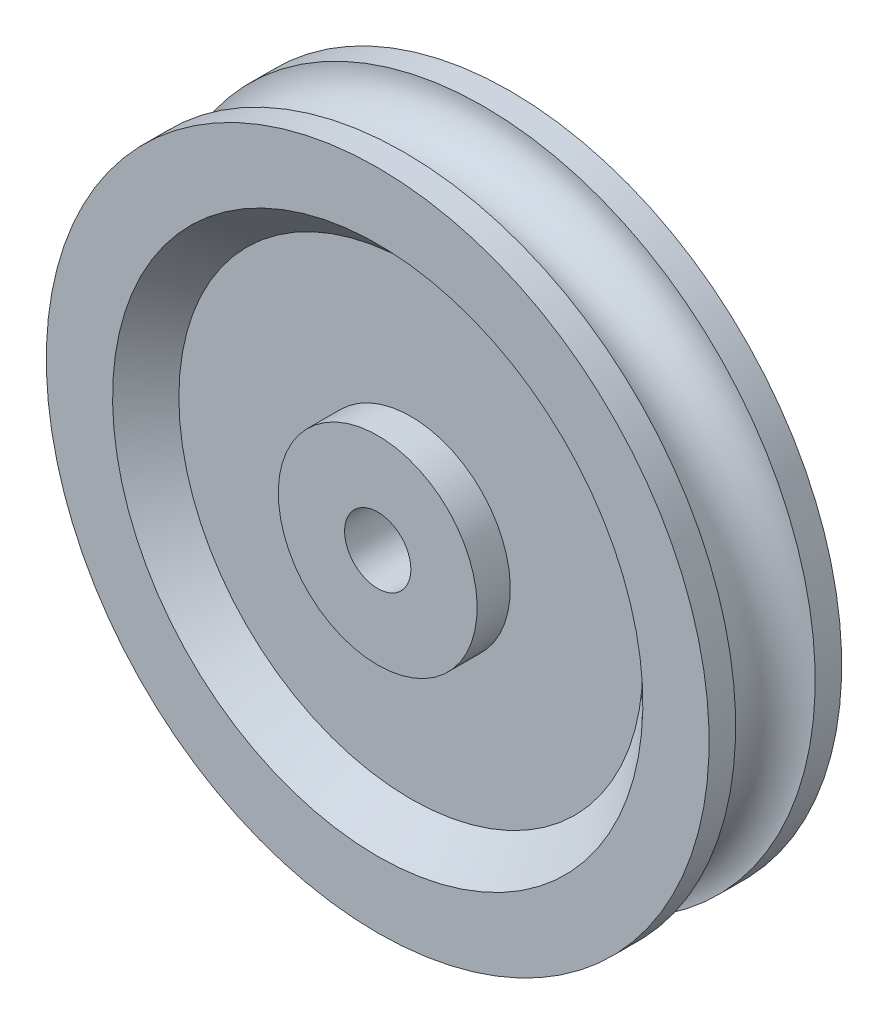
ISO-10303-21;
HEADER;
FILE_DESCRIPTION(('STEP AP214'),'2;1');
FILE_NAME('part.step','',(''),(''),'','','');
FILE_SCHEMA(('AUTOMOTIVE_DESIGN { 1 0 10303 214 1 1 1 1 }'));
ENDSEC;
DATA;
#1=APPLICATION_CONTEXT('core data for automotive mechanical design processes');
#2=APPLICATION_PROTOCOL_DEFINITION('international standard','automotive_design',2000,#1);
#3=PRODUCT_CONTEXT('',#1,'mechanical');
#4=PRODUCT('Part','Part','',(#3));
#5=PRODUCT_RELATED_PRODUCT_CATEGORY('part','',(#4));
#6=PRODUCT_DEFINITION_FORMATION('','',#4);
#7=PRODUCT_DEFINITION_CONTEXT('part definition',#1,'design');
#8=PRODUCT_DEFINITION('design','',#6,#7);
#9=PRODUCT_DEFINITION_SHAPE('','',#8);
#10=(LENGTH_UNIT() NAMED_UNIT(*) SI_UNIT(.MILLI.,.METRE.));
#11=(NAMED_UNIT(*) PLANE_ANGLE_UNIT() SI_UNIT($,.RADIAN.));
#12=(NAMED_UNIT(*) SI_UNIT($,.STERADIAN.) SOLID_ANGLE_UNIT());
#13=UNCERTAINTY_MEASURE_WITH_UNIT(LENGTH_MEASURE(1.E-05),#10,'distance_accuracy_value','');
#14=(GEOMETRIC_REPRESENTATION_CONTEXT(3) GLOBAL_UNCERTAINTY_ASSIGNED_CONTEXT((#13)) GLOBAL_UNIT_ASSIGNED_CONTEXT((#10,
#11,#12)) REPRESENTATION_CONTEXT('',''));
#15=CARTESIAN_POINT('',(0.,0.,0.));
#16=DIRECTION('',(0.,0.,1.));
#17=DIRECTION('',(1.,0.,0.));
#18=AXIS2_PLACEMENT_3D('',#15,#16,#17);
#19=CARTESIAN_POINT('',(0.,40.,-10.));
#20=DIRECTION('',(0.,0.,1.));
#21=DIRECTION('',(0.,-1.,0.));
#22=AXIS2_PLACEMENT_3D('',#19,#20,#21);
#23=PLANE('',#22);
#24=CARTESIAN_POINT('',(0.,0.,-10.));
#25=DIRECTION('',(0.,0.,1.));
#26=DIRECTION('',(0.,-1.,0.));
#27=AXIS2_PLACEMENT_3D('',#24,#25,#26);
#28=CIRCLE('',#27,50.);
#29=CARTESIAN_POINT('',(0.,-50.,-10.));
#30=VERTEX_POINT('',#29);
#31=EDGE_CURVE('E10',#30,#30,#28,.T.);
#32=ORIENTED_EDGE('',*,*,#31,.F.);
#33=EDGE_LOOP('',(#32));
#34=FACE_BOUND('',#33,.T.);
#35=CARTESIAN_POINT('',(0.,0.,-10.));
#36=DIRECTION('',(0.,0.,1.));
#37=DIRECTION('',(0.,-1.,0.));
#38=AXIS2_PLACEMENT_3D('',#35,#36,#37);
#39=CIRCLE('',#38,40.);
#40=CARTESIAN_POINT('',(0.,-40.,-10.));
#41=VERTEX_POINT('',#40);
#42=EDGE_CURVE('E73',#41,#41,#39,.T.);
#43=ORIENTED_EDGE('',*,*,#42,.T.);
#44=EDGE_LOOP('',(#43));
#45=FACE_BOUND('',#44,.T.);
#46=ADVANCED_FACE('F33',(#34,#45),#23,.F.);
#47=CARTESIAN_POINT('',(0.,0.,9.99999999999999));
#48=DIRECTION('',(0.,0.,1.));
#49=DIRECTION('',(0.,-1.,0.));
#50=AXIS2_PLACEMENT_3D('',#47,#48,#49);
#51=CYLINDRICAL_SURFACE('',#50,50.);
#52=CARTESIAN_POINT('',(0.,0.,-6.00000000000001));
#53=DIRECTION('',(0.,0.,1.));
#54=DIRECTION('',(0.,-1.,0.));
#55=AXIS2_PLACEMENT_3D('',#52,#53,#54);
#56=CIRCLE('',#55,50.);
#57=CARTESIAN_POINT('',(0.,-50.,-6.00000000000001));
#58=VERTEX_POINT('',#57);
#59=EDGE_CURVE('E39',#58,#58,#56,.T.);
#60=ORIENTED_EDGE('',*,*,#59,.F.);
#61=EDGE_LOOP('',(#60));
#62=FACE_BOUND('',#61,.T.);
#63=ORIENTED_EDGE('',*,*,#31,.T.);
#64=EDGE_LOOP('',(#63));
#65=FACE_BOUND('',#64,.T.);
#66=ADVANCED_FACE('F131',(#62,#65),#51,.T.);
#67=CARTESIAN_POINT('',(0.,0.,0.));
#68=DIRECTION('',(0.,0.,1.));
#69=DIRECTION('',(0.,-1.,0.));
#70=AXIS2_PLACEMENT_3D('',#67,#68,#69);
#71=TOROIDAL_SURFACE('',#70,50.,6.);
#72=CARTESIAN_POINT('',(0.,0.,5.99999999999999));
#73=DIRECTION('',(0.,0.,1.));
#74=DIRECTION('',(0.,-1.,0.));
#75=AXIS2_PLACEMENT_3D('',#72,#73,#74);
#76=CIRCLE('',#75,50.);
#77=CARTESIAN_POINT('',(0.,-50.,5.99999999999999));
#78=VERTEX_POINT('',#77);
#79=EDGE_CURVE('E43',#78,#78,#76,.T.);
#80=ORIENTED_EDGE('',*,*,#79,.F.);
#81=EDGE_LOOP('',(#80));
#82=FACE_BOUND('',#81,.T.);
#83=ORIENTED_EDGE('',*,*,#59,.T.);
#84=EDGE_LOOP('',(#83));
#85=FACE_BOUND('',#84,.T.);
#86=ADVANCED_FACE('F126',(#82,#85),#71,.F.);
#87=CARTESIAN_POINT('',(0.,0.,9.99999999999999));
#88=DIRECTION('',(0.,0.,1.));
#89=DIRECTION('',(0.,-1.,0.));
#90=AXIS2_PLACEMENT_3D('',#87,#88,#89);
#91=CYLINDRICAL_SURFACE('',#90,50.);
#92=CARTESIAN_POINT('',(0.,0.,10.));
#93=DIRECTION('',(0.,0.,1.));
#94=DIRECTION('',(0.,-1.,0.));
#95=AXIS2_PLACEMENT_3D('',#92,#93,#94);
#96=CIRCLE('',#95,50.);
#97=CARTESIAN_POINT('',(0.,-50.,9.99999999999999));
#98=VERTEX_POINT('',#97);
#99=EDGE_CURVE('E47',#98,#98,#96,.T.);
#100=ORIENTED_EDGE('',*,*,#99,.F.);
#101=EDGE_LOOP('',(#100));
#102=FACE_BOUND('',#101,.T.);
#103=ORIENTED_EDGE('',*,*,#79,.T.);
#104=EDGE_LOOP('',(#103));
#105=FACE_BOUND('',#104,.T.);
#106=ADVANCED_FACE('F120',(#102,#105),#91,.T.);
#107=CARTESIAN_POINT('',(0.,40.,10.));
#108=DIRECTION('',(0.,0.,-1.));
#109=DIRECTION('',(0.,1.,0.));
#110=AXIS2_PLACEMENT_3D('',#107,#108,#109);
#111=PLANE('',#110);
#112=CARTESIAN_POINT('',(0.,0.,9.99999999999999));
#113=DIRECTION('',(0.,0.,1.));
#114=DIRECTION('',(0.,-1.,0.));
#115=AXIS2_PLACEMENT_3D('',#112,#113,#114);
#116=CIRCLE('',#115,40.);
#117=CARTESIAN_POINT('',(0.,-40.,9.99999999999998));
#118=VERTEX_POINT('',#117);
#119=EDGE_CURVE('E52',#118,#118,#116,.T.);
#120=ORIENTED_EDGE('',*,*,#119,.F.);
#121=EDGE_LOOP('',(#120));
#122=FACE_BOUND('',#121,.T.);
#123=ORIENTED_EDGE('',*,*,#99,.T.);
#124=EDGE_LOOP('',(#123));
#125=FACE_BOUND('',#124,.T.);
#126=ADVANCED_FACE('F114',(#122,#125),#111,.F.);
#127=CARTESIAN_POINT('',(0.,0.,9.99999999999999));
#128=DIRECTION('',(0.,0.,1.));
#129=DIRECTION('',(0.,-1.,0.));
#130=AXIS2_PLACEMENT_3D('',#127,#128,#129);
#131=CONICAL_SURFACE('',#130,40.,0.785398163397449);
#132=CARTESIAN_POINT('',(0.,0.,4.99999999999999));
#133=DIRECTION('',(0.,0.,1.));
#134=DIRECTION('',(0.,-1.,0.));
#135=AXIS2_PLACEMENT_3D('',#132,#133,#134);
#136=CIRCLE('',#135,35.);
#137=CARTESIAN_POINT('',(0.,-35.,4.99999999999999));
#138=VERTEX_POINT('',#137);
#139=EDGE_CURVE('E55',#138,#138,#136,.T.);
#140=ORIENTED_EDGE('',*,*,#139,.F.);
#141=EDGE_LOOP('',(#140));
#142=FACE_BOUND('',#141,.T.);
#143=ORIENTED_EDGE('',*,*,#119,.T.);
#144=EDGE_LOOP('',(#143));
#145=FACE_BOUND('',#144,.T.);
#146=ADVANCED_FACE('F108',(#142,#145),#131,.F.);
#147=CARTESIAN_POINT('',(0.,35.,5.));
#148=DIRECTION('',(0.,0.,-1.));
#149=DIRECTION('',(0.,1.,0.));
#150=AXIS2_PLACEMENT_3D('',#147,#148,#149);
#151=PLANE('',#150);
#152=CARTESIAN_POINT('',(0.,0.,4.99999999999999));
#153=DIRECTION('',(0.,0.,1.));
#154=DIRECTION('',(0.,-1.,0.));
#155=AXIS2_PLACEMENT_3D('',#152,#153,#154);
#156=CIRCLE('',#155,15.);
#157=CARTESIAN_POINT('',(0.,-15.,4.99999999999999));
#158=VERTEX_POINT('',#157);
#159=EDGE_CURVE('E58',#158,#158,#156,.T.);
#160=ORIENTED_EDGE('',*,*,#159,.F.);
#161=EDGE_LOOP('',(#160));
#162=FACE_BOUND('',#161,.T.);
#163=ORIENTED_EDGE('',*,*,#139,.T.);
#164=EDGE_LOOP('',(#163));
#165=FACE_BOUND('',#164,.T.);
#166=ADVANCED_FACE('F102',(#162,#165),#151,.F.);
#167=CARTESIAN_POINT('',(0.,0.,9.99999999999999));
#168=DIRECTION('',(0.,0.,1.));
#169=DIRECTION('',(0.,-1.,0.));
#170=AXIS2_PLACEMENT_3D('',#167,#168,#169);
#171=CYLINDRICAL_SURFACE('',#170,15.);
#172=CARTESIAN_POINT('',(0.,0.,9.99999999999999));
#173=DIRECTION('',(0.,0.,1.));
#174=DIRECTION('',(0.,-1.,0.));
#175=AXIS2_PLACEMENT_3D('',#172,#173,#174);
#176=CIRCLE('',#175,15.);
#177=CARTESIAN_POINT('',(0.,-15.,9.99999999999999));
#178=VERTEX_POINT('',#177);
#179=EDGE_CURVE('E61',#178,#178,#176,.T.);
#180=ORIENTED_EDGE('',*,*,#179,.F.);
#181=EDGE_LOOP('',(#180));
#182=FACE_BOUND('',#181,.T.);
#183=ORIENTED_EDGE('',*,*,#159,.T.);
#184=EDGE_LOOP('',(#183));
#185=FACE_BOUND('',#184,.T.);
#186=ADVANCED_FACE('F96',(#182,#185),#171,.T.);
#187=CARTESIAN_POINT('',(0.,0.,9.99999999999999));
#188=DIRECTION('',(0.,0.,-1.));
#189=DIRECTION('',(0.,1.,0.));
#190=AXIS2_PLACEMENT_3D('',#187,#188,#189);
#191=PLANE('',#190);
#192=CARTESIAN_POINT('',(0.,0.,9.99999999999999));
#193=DIRECTION('',(0.,0.,1.));
#194=DIRECTION('',(1.,0.,0.));
#195=AXIS2_PLACEMENT_3D('',#192,#193,#194);
#196=CIRCLE('',#195,5.);
#197=CARTESIAN_POINT('',(5.,0.,9.99999999999999));
#198=VERTEX_POINT('',#197);
#199=EDGE_CURVE('E77',#198,#198,#196,.T.);
#200=ORIENTED_EDGE('',*,*,#199,.F.);
#201=EDGE_LOOP('',(#200));
#202=FACE_BOUND('',#201,.T.);
#203=ORIENTED_EDGE('',*,*,#179,.T.);
#204=EDGE_LOOP('',(#203));
#205=FACE_BOUND('',#204,.T.);
#206=ADVANCED_FACE('F93',(#202,#205),#191,.F.);
#207=CARTESIAN_POINT('',(0.,0.,-10.));
#208=DIRECTION('',(0.,0.,1.));
#209=DIRECTION('',(0.,-1.,0.));
#210=AXIS2_PLACEMENT_3D('',#207,#208,#209);
#211=PLANE('',#210);
#212=CARTESIAN_POINT('',(0.,0.,-10.));
#213=DIRECTION('',(0.,0.,1.));
#214=DIRECTION('',(1.,0.,0.));
#215=AXIS2_PLACEMENT_3D('',#212,#213,#214);
#216=CIRCLE('',#215,5.);
#217=CARTESIAN_POINT('',(5.,0.,-10.));
#218=VERTEX_POINT('',#217);
#219=EDGE_CURVE('E76',#218,#218,#216,.T.);
#220=ORIENTED_EDGE('',*,*,#219,.T.);
#221=EDGE_LOOP('',(#220));
#222=FACE_BOUND('',#221,.T.);
#223=CARTESIAN_POINT('',(0.,0.,-10.));
#224=DIRECTION('',(0.,0.,1.));
#225=DIRECTION('',(0.,-1.,0.));
#226=AXIS2_PLACEMENT_3D('',#223,#224,#225);
#227=CIRCLE('',#226,15.);
#228=CARTESIAN_POINT('',(0.,-15.,-10.));
#229=VERTEX_POINT('',#228);
#230=EDGE_CURVE('E64',#229,#229,#227,.T.);
#231=ORIENTED_EDGE('',*,*,#230,.F.);
#232=EDGE_LOOP('',(#231));
#233=FACE_BOUND('',#232,.T.);
#234=ADVANCED_FACE('F83',(#222,#233),#211,.F.);
#235=CARTESIAN_POINT('',(0.,0.,9.99999999999999));
#236=DIRECTION('',(0.,0.,1.));
#237=DIRECTION('',(0.,-1.,0.));
#238=AXIS2_PLACEMENT_3D('',#235,#236,#237);
#239=CYLINDRICAL_SURFACE('',#238,15.);
#240=CARTESIAN_POINT('',(0.,0.,-5.00000000000001));
#241=DIRECTION('',(0.,0.,1.));
#242=DIRECTION('',(0.,-1.,0.));
#243=AXIS2_PLACEMENT_3D('',#240,#241,#242);
#244=CIRCLE('',#243,15.);
#245=CARTESIAN_POINT('',(0.,-15.,-5.00000000000001));
#246=VERTEX_POINT('',#245);
#247=EDGE_CURVE('E67',#246,#246,#244,.T.);
#248=ORIENTED_EDGE('',*,*,#247,.F.);
#249=EDGE_LOOP('',(#248));
#250=FACE_BOUND('',#249,.T.);
#251=ORIENTED_EDGE('',*,*,#230,.T.);
#252=EDGE_LOOP('',(#251));
#253=FACE_BOUND('',#252,.T.);
#254=ADVANCED_FACE('F152',(#250,#253),#239,.T.);
#255=CARTESIAN_POINT('',(0.,35.,-5.));
#256=DIRECTION('',(0.,0.,1.));
#257=DIRECTION('',(0.,-1.,0.));
#258=AXIS2_PLACEMENT_3D('',#255,#256,#257);
#259=PLANE('',#258);
#260=CARTESIAN_POINT('',(0.,0.,-5.));
#261=DIRECTION('',(0.,0.,1.));
#262=DIRECTION('',(0.,-1.,0.));
#263=AXIS2_PLACEMENT_3D('',#260,#261,#262);
#264=CIRCLE('',#263,35.);
#265=CARTESIAN_POINT('',(0.,-35.,-5.00000000000001));
#266=VERTEX_POINT('',#265);
#267=EDGE_CURVE('E70',#266,#266,#264,.T.);
#268=ORIENTED_EDGE('',*,*,#267,.F.);
#269=EDGE_LOOP('',(#268));
#270=FACE_BOUND('',#269,.T.);
#271=ORIENTED_EDGE('',*,*,#247,.T.);
#272=EDGE_LOOP('',(#271));
#273=FACE_BOUND('',#272,.T.);
#274=ADVANCED_FACE('F146',(#270,#273),#259,.F.);
#275=CARTESIAN_POINT('',(0.,0.,-5.));
#276=DIRECTION('',(0.,0.,-1.));
#277=DIRECTION('',(0.,1.,0.));
#278=AXIS2_PLACEMENT_3D('',#275,#276,#277);
#279=CONICAL_SURFACE('',#278,35.,0.785398163397449);
#280=ORIENTED_EDGE('',*,*,#42,.F.);
#281=EDGE_LOOP('',(#280));
#282=FACE_BOUND('',#281,.T.);
#283=ORIENTED_EDGE('',*,*,#267,.T.);
#284=EDGE_LOOP('',(#283));
#285=FACE_BOUND('',#284,.T.);
#286=ADVANCED_FACE('F89',(#282,#285),#279,.F.);
#287=CARTESIAN_POINT('',(0.,0.,-10.));
#288=DIRECTION('',(0.,0.,1.));
#289=DIRECTION('',(1.,0.,0.));
#290=AXIS2_PLACEMENT_3D('',#287,#288,#289);
#291=CYLINDRICAL_SURFACE('',#290,5.);
#292=ORIENTED_EDGE('',*,*,#219,.F.);
#293=EDGE_LOOP('',(#292));
#294=FACE_BOUND('',#293,.T.);
#295=ORIENTED_EDGE('',*,*,#199,.T.);
#296=EDGE_LOOP('',(#295));
#297=FACE_BOUND('',#296,.T.);
#298=ADVANCED_FACE('F86',(#294,#297),#291,.F.);
#299=CLOSED_SHELL('',(#46,#66,#86,#106,#126,#146,#166,#186,#206,#234,#254,#274,#286,#298));
#300=MANIFOLD_SOLID_BREP('B2',#299);
#301=ADVANCED_BREP_SHAPE_REPRESENTATION('',(#18,#300),#14);
#302=SHAPE_DEFINITION_REPRESENTATION(#9,#301);
ENDSEC;
END-ISO-10303-21;
